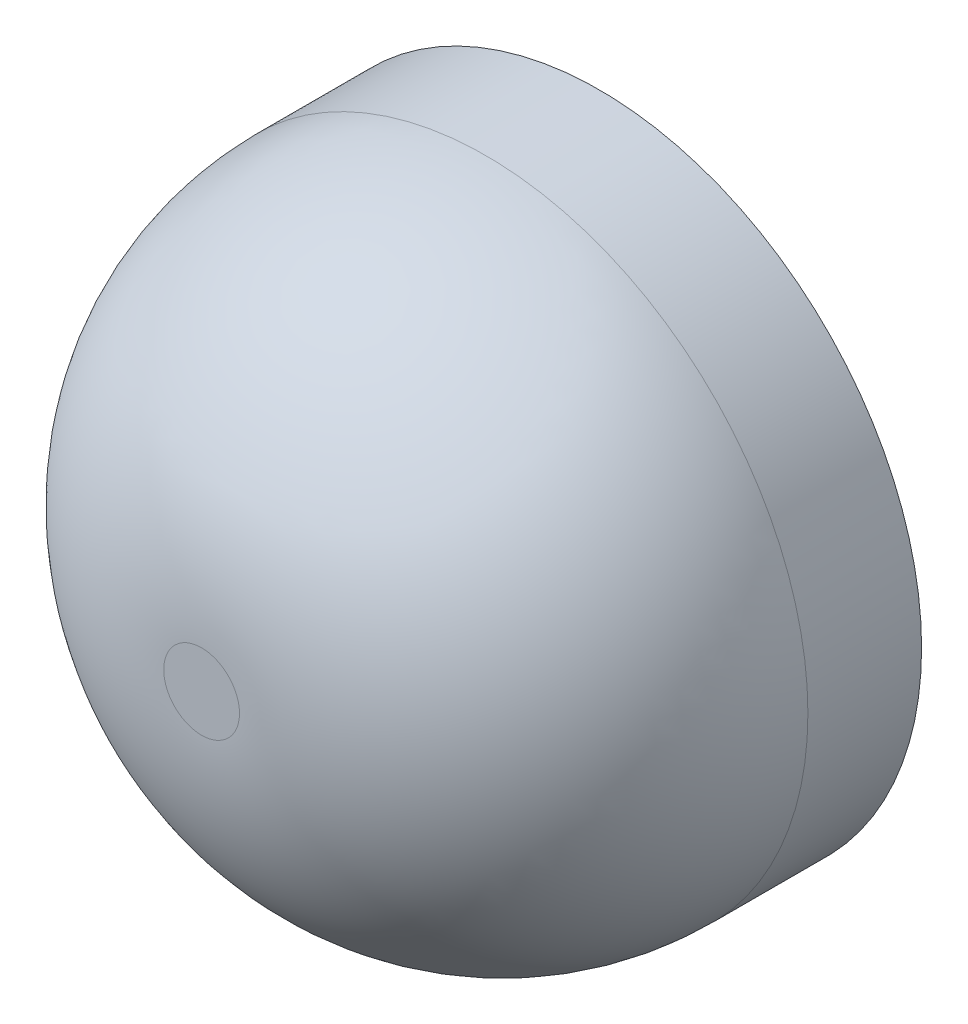
ISO-10303-21;
HEADER;
FILE_DESCRIPTION(('STEP AP214'),'2;1');
FILE_NAME('part.step','',(''),(''),'','','');
FILE_SCHEMA(('AUTOMOTIVE_DESIGN { 1 0 10303 214 1 1 1 1 }'));
ENDSEC;
DATA;
#1=APPLICATION_CONTEXT('core data for automotive mechanical design processes');
#2=APPLICATION_PROTOCOL_DEFINITION('international standard','automotive_design',2000,#1);
#3=PRODUCT_CONTEXT('',#1,'mechanical');
#4=PRODUCT('Part','Part','',(#3));
#5=PRODUCT_RELATED_PRODUCT_CATEGORY('part','',(#4));
#6=PRODUCT_DEFINITION_FORMATION('','',#4);
#7=PRODUCT_DEFINITION_CONTEXT('part definition',#1,'design');
#8=PRODUCT_DEFINITION('design','',#6,#7);
#9=PRODUCT_DEFINITION_SHAPE('','',#8);
#10=(LENGTH_UNIT() NAMED_UNIT(*) SI_UNIT(.MILLI.,.METRE.));
#11=(NAMED_UNIT(*) PLANE_ANGLE_UNIT() SI_UNIT($,.RADIAN.));
#12=(NAMED_UNIT(*) SI_UNIT($,.STERADIAN.) SOLID_ANGLE_UNIT());
#13=UNCERTAINTY_MEASURE_WITH_UNIT(LENGTH_MEASURE(1.E-05),#10,'distance_accuracy_value','');
#14=(GEOMETRIC_REPRESENTATION_CONTEXT(3) GLOBAL_UNCERTAINTY_ASSIGNED_CONTEXT((#13)) GLOBAL_UNIT_ASSIGNED_CONTEXT((#10,
#11,#12)) REPRESENTATION_CONTEXT('',''));
#15=CARTESIAN_POINT('',(0.,0.,0.));
#16=DIRECTION('',(0.,0.,1.));
#17=DIRECTION('',(1.,0.,0.));
#18=AXIS2_PLACEMENT_3D('',#15,#16,#17);
#19=CARTESIAN_POINT('',(0.,0.,21.));
#20=DIRECTION('',(0.,0.,-1.));
#21=DIRECTION('',(-1.,0.,0.));
#22=AXIS2_PLACEMENT_3D('',#19,#20,#21);
#23=CYLINDRICAL_SURFACE('',#22,17.);
#24=CARTESIAN_POINT('',(0.,0.,6.00000000000001));
#25=DIRECTION('',(0.,0.,1.));
#26=DIRECTION('',(1.,0.,0.));
#27=AXIS2_PLACEMENT_3D('',#24,#25,#26);
#28=CIRCLE('',#27,17.);
#29=CARTESIAN_POINT('',(17.,0.,6.00000000000001));
#30=VERTEX_POINT('',#29);
#31=EDGE_CURVE('E10',#30,#30,#28,.F.);
#32=ORIENTED_EDGE('',*,*,#31,.T.);
#33=EDGE_LOOP('',(#32));
#34=FACE_BOUND('',#33,.T.);
#35=CARTESIAN_POINT('',(0.,0.,0.));
#36=DIRECTION('',(0.,0.,1.));
#37=DIRECTION('',(1.,0.,0.));
#38=AXIS2_PLACEMENT_3D('',#35,#36,#37);
#39=CIRCLE('',#38,17.);
#40=CARTESIAN_POINT('',(17.,0.,0.));
#41=VERTEX_POINT('',#40);
#42=EDGE_CURVE('E48',#41,#41,#39,.T.);
#43=ORIENTED_EDGE('',*,*,#42,.T.);
#44=EDGE_LOOP('',(#43));
#45=FACE_BOUND('',#44,.T.);
#46=ADVANCED_FACE('F40',(#34,#45),#23,.T.);
#47=CARTESIAN_POINT('',(0.,0.,21.));
#48=DIRECTION('',(0.,0.,1.));
#49=DIRECTION('',(1.,0.,0.));
#50=AXIS2_PLACEMENT_3D('',#47,#48,#49);
#51=PLANE('',#50);
#52=CARTESIAN_POINT('',(0.,0.,21.));
#53=DIRECTION('',(0.,0.,1.));
#54=DIRECTION('',(1.,0.,0.));
#55=AXIS2_PLACEMENT_3D('',#52,#53,#54);
#56=CIRCLE('',#55,2.00000000000001);
#57=CARTESIAN_POINT('',(2.00000000000001,0.,21.));
#58=VERTEX_POINT('',#57);
#59=EDGE_CURVE('E42',#58,#58,#56,.T.);
#60=ORIENTED_EDGE('',*,*,#59,.T.);
#61=EDGE_LOOP('',(#60));
#62=FACE_BOUND('',#61,.T.);
#63=ADVANCED_FACE('F80',(#62),#51,.T.);
#64=CARTESIAN_POINT('',(0.,0.,0.));
#65=DIRECTION('',(0.,0.,1.));
#66=DIRECTION('',(1.,0.,0.));
#67=AXIS2_PLACEMENT_3D('',#64,#65,#66);
#68=PLANE('',#67);
#69=CARTESIAN_POINT('',(0.,0.,0.));
#70=DIRECTION('',(0.,0.,1.));
#71=DIRECTION('',(1.,0.,0.));
#72=AXIS2_PLACEMENT_3D('',#69,#70,#71);
#73=CIRCLE('',#72,16.);
#74=CARTESIAN_POINT('',(16.,0.,0.));
#75=VERTEX_POINT('',#74);
#76=EDGE_CURVE('E54',#75,#75,#73,.T.);
#77=ORIENTED_EDGE('',*,*,#76,.T.);
#78=EDGE_LOOP('',(#77));
#79=FACE_BOUND('',#78,.T.);
#80=ORIENTED_EDGE('',*,*,#42,.F.);
#81=EDGE_LOOP('',(#80));
#82=FACE_BOUND('',#81,.T.);
#83=ADVANCED_FACE('F74',(#79,#82),#68,.F.);
#84=CARTESIAN_POINT('',(0.,0.,6.00000000000001));
#85=DIRECTION('',(0.,0.,1.));
#86=DIRECTION('',(1.,0.,0.));
#87=AXIS2_PLACEMENT_3D('',#84,#85,#86);
#88=DEGENERATE_TOROIDAL_SURFACE('',#87,2.00000000000001,15.,.T.);
#89=ORIENTED_EDGE('',*,*,#31,.F.);
#90=EDGE_LOOP('',(#89));
#91=FACE_BOUND('',#90,.T.);
#92=ORIENTED_EDGE('',*,*,#59,.F.);
#93=EDGE_LOOP('',(#92));
#94=FACE_BOUND('',#93,.T.);
#95=ADVANCED_FACE('F39',(#91,#94),#88,.T.);
#96=CARTESIAN_POINT('',(0.,0.,21.));
#97=DIRECTION('',(0.,0.,-1.));
#98=DIRECTION('',(-1.,0.,0.));
#99=AXIS2_PLACEMENT_3D('',#96,#97,#98);
#100=CYLINDRICAL_SURFACE('',#99,16.);
#101=CARTESIAN_POINT('',(0.,0.,6.00000000000001));
#102=DIRECTION('',(0.,0.,-1.));
#103=DIRECTION('',(-1.,0.,0.));
#104=AXIS2_PLACEMENT_3D('',#101,#102,#103);
#105=CIRCLE('',#104,16.);
#106=CARTESIAN_POINT('',(-16.,0.,6.00000000000001));
#107=VERTEX_POINT('',#106);
#108=EDGE_CURVE('E55',#107,#107,#105,.T.);
#109=ORIENTED_EDGE('',*,*,#108,.F.);
#110=EDGE_LOOP('',(#109));
#111=FACE_BOUND('',#110,.T.);
#112=ORIENTED_EDGE('',*,*,#76,.F.);
#113=EDGE_LOOP('',(#112));
#114=FACE_BOUND('',#113,.T.);
#115=ADVANCED_FACE('F70',(#111,#114),#100,.F.);
#116=CARTESIAN_POINT('',(0.,0.,20.));
#117=DIRECTION('',(0.,0.,1.));
#118=DIRECTION('',(1.,0.,0.));
#119=AXIS2_PLACEMENT_3D('',#116,#117,#118);
#120=PLANE('',#119);
#121=CARTESIAN_POINT('',(0.,0.,20.));
#122=DIRECTION('',(0.,0.,1.));
#123=DIRECTION('',(1.,0.,0.));
#124=AXIS2_PLACEMENT_3D('',#121,#122,#123);
#125=CIRCLE('',#124,2.00000000000001);
#126=CARTESIAN_POINT('',(2.00000000000001,0.,20.));
#127=VERTEX_POINT('',#126);
#128=EDGE_CURVE('E59',#127,#127,#125,.T.);
#129=ORIENTED_EDGE('',*,*,#128,.F.);
#130=EDGE_LOOP('',(#129));
#131=FACE_BOUND('',#130,.T.);
#132=ADVANCED_FACE('F69',(#131),#120,.F.);
#133=CARTESIAN_POINT('',(0.,0.,6.00000000000001));
#134=DIRECTION('',(0.,0.,1.));
#135=DIRECTION('',(1.,0.,0.));
#136=AXIS2_PLACEMENT_3D('',#133,#134,#135);
#137=DEGENERATE_TOROIDAL_SURFACE('',#136,2.00000000000001,14.,.T.);
#138=ORIENTED_EDGE('',*,*,#108,.T.);
#139=EDGE_LOOP('',(#138));
#140=FACE_BOUND('',#139,.T.);
#141=ORIENTED_EDGE('',*,*,#128,.T.);
#142=EDGE_LOOP('',(#141));
#143=FACE_BOUND('',#142,.T.);
#144=ADVANCED_FACE('F63',(#140,#143),#137,.F.);
#145=CLOSED_SHELL('',(#46,#63,#83,#95,#115,#132,#144));
#146=MANIFOLD_SOLID_BREP('B2',#145);
#147=ADVANCED_BREP_SHAPE_REPRESENTATION('',(#18,#146),#14);
#148=SHAPE_DEFINITION_REPRESENTATION(#9,#147);
ENDSEC;
END-ISO-10303-21;
